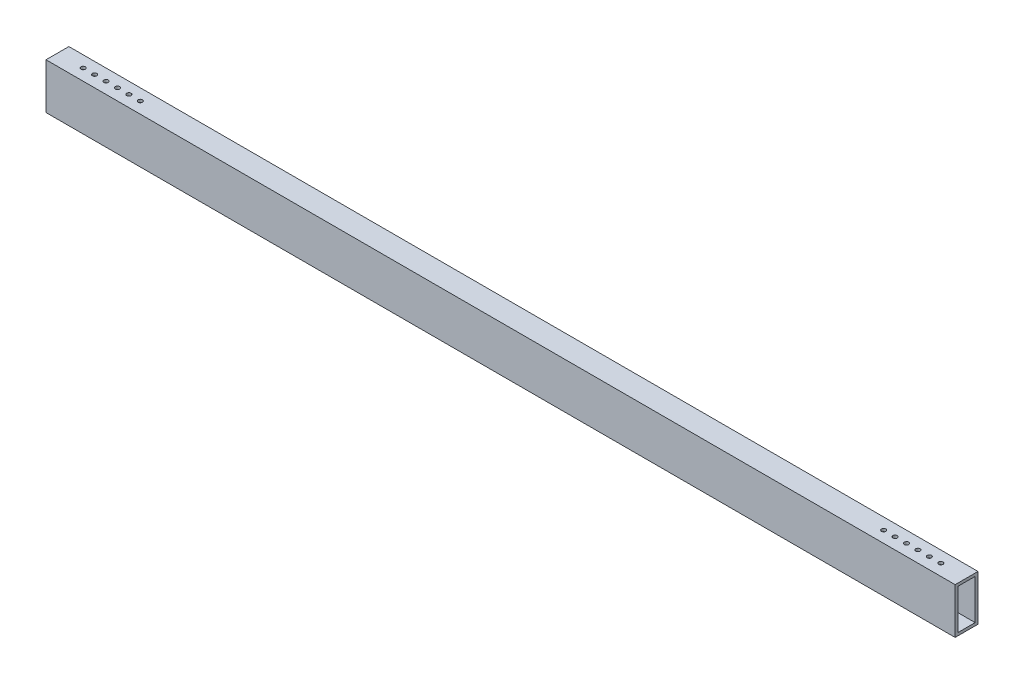
ISO-10303-21;
HEADER;
FILE_DESCRIPTION(('STEP AP214'),'2;1');
FILE_NAME('part.step','',(''),(''),'','','');
FILE_SCHEMA(('AUTOMOTIVE_DESIGN { 1 0 10303 214 1 1 1 1 }'));
ENDSEC;
DATA;
#1=APPLICATION_CONTEXT('core data for automotive mechanical design processes');
#2=APPLICATION_PROTOCOL_DEFINITION('international standard','automotive_design',2000,#1);
#3=PRODUCT_CONTEXT('',#1,'mechanical');
#4=PRODUCT('Part','Part','',(#3));
#5=PRODUCT_RELATED_PRODUCT_CATEGORY('part','',(#4));
#6=PRODUCT_DEFINITION_FORMATION('','',#4);
#7=PRODUCT_DEFINITION_CONTEXT('part definition',#1,'design');
#8=PRODUCT_DEFINITION('design','',#6,#7);
#9=PRODUCT_DEFINITION_SHAPE('','',#8);
#10=(LENGTH_UNIT() NAMED_UNIT(*) SI_UNIT(.MILLI.,.METRE.));
#11=(NAMED_UNIT(*) PLANE_ANGLE_UNIT() SI_UNIT($,.RADIAN.));
#12=(NAMED_UNIT(*) SI_UNIT($,.STERADIAN.) SOLID_ANGLE_UNIT());
#13=UNCERTAINTY_MEASURE_WITH_UNIT(LENGTH_MEASURE(1.E-05),#10,'distance_accuracy_value','');
#14=(GEOMETRIC_REPRESENTATION_CONTEXT(3) GLOBAL_UNCERTAINTY_ASSIGNED_CONTEXT((#13)) GLOBAL_UNIT_ASSIGNED_CONTEXT((#10,
#11,#12)) REPRESENTATION_CONTEXT('',''));
#15=CARTESIAN_POINT('',(0.,0.,0.));
#16=DIRECTION('',(0.,0.,1.));
#17=DIRECTION('',(1.,0.,0.));
#18=AXIS2_PLACEMENT_3D('',#15,#16,#17);
#19=CARTESIAN_POINT('',(412.75,19.05,0.));
#20=DIRECTION('',(0.,1.,0.));
#21=DIRECTION('',(0.,0.,1.));
#22=AXIS2_PLACEMENT_3D('',#19,#20,#21);
#23=CYLINDRICAL_SURFACE('',#22,2.413);
#24=CARTESIAN_POINT('',(412.75,22.225,0.));
#25=DIRECTION('',(0.,1.,0.));
#26=DIRECTION('',(0.,0.,1.));
#27=AXIS2_PLACEMENT_3D('',#24,#25,#26);
#28=CIRCLE('',#27,2.413);
#29=CARTESIAN_POINT('',(412.75,22.225,2.413));
#30=VERTEX_POINT('',#29);
#31=EDGE_CURVE('E20',#30,#30,#28,.F.);
#32=ORIENTED_EDGE('',*,*,#31,.T.);
#33=EDGE_LOOP('',(#32));
#34=FACE_BOUND('',#33,.T.);
#35=CARTESIAN_POINT('',(412.75,25.4,0.));
#36=DIRECTION('',(0.,1.,0.));
#37=DIRECTION('',(0.,0.,1.));
#38=AXIS2_PLACEMENT_3D('',#35,#36,#37);
#39=CIRCLE('',#38,2.413);
#40=CARTESIAN_POINT('',(412.75,25.4,2.413));
#41=VERTEX_POINT('',#40);
#42=EDGE_CURVE('E94',#41,#41,#39,.T.);
#43=ORIENTED_EDGE('',*,*,#42,.T.);
#44=EDGE_LOOP('',(#43));
#45=FACE_BOUND('',#44,.T.);
#46=ADVANCED_FACE('F17',(#34,#45),#23,.F.);
#47=CARTESIAN_POINT('',(425.45,19.05,0.));
#48=DIRECTION('',(0.,1.,0.));
#49=DIRECTION('',(0.,0.,1.));
#50=AXIS2_PLACEMENT_3D('',#47,#48,#49);
#51=CYLINDRICAL_SURFACE('',#50,2.413);
#52=CARTESIAN_POINT('',(425.45,22.225,0.));
#53=DIRECTION('',(0.,1.,0.));
#54=DIRECTION('',(0.,0.,1.));
#55=AXIS2_PLACEMENT_3D('',#52,#53,#54);
#56=CIRCLE('',#55,2.413);
#57=CARTESIAN_POINT('',(425.45,22.225,2.413));
#58=VERTEX_POINT('',#57);
#59=EDGE_CURVE('E193',#58,#58,#56,.F.);
#60=ORIENTED_EDGE('',*,*,#59,.T.);
#61=EDGE_LOOP('',(#60));
#62=FACE_BOUND('',#61,.T.);
#63=CARTESIAN_POINT('',(425.45,25.4,0.));
#64=DIRECTION('',(0.,1.,0.));
#65=DIRECTION('',(0.,0.,1.));
#66=AXIS2_PLACEMENT_3D('',#63,#64,#65);
#67=CIRCLE('',#66,2.413);
#68=CARTESIAN_POINT('',(425.45,25.4,2.413));
#69=VERTEX_POINT('',#68);
#70=EDGE_CURVE('E156',#69,#69,#67,.T.);
#71=ORIENTED_EDGE('',*,*,#70,.T.);
#72=EDGE_LOOP('',(#71));
#73=FACE_BOUND('',#72,.T.);
#74=ADVANCED_FACE('F301',(#62,#73),#51,.F.);
#75=CARTESIAN_POINT('',(438.15,19.05,0.));
#76=DIRECTION('',(0.,1.,0.));
#77=DIRECTION('',(0.,0.,1.));
#78=AXIS2_PLACEMENT_3D('',#75,#76,#77);
#79=CYLINDRICAL_SURFACE('',#78,2.413);
#80=CARTESIAN_POINT('',(438.15,22.225,0.));
#81=DIRECTION('',(0.,1.,0.));
#82=DIRECTION('',(0.,0.,1.));
#83=AXIS2_PLACEMENT_3D('',#80,#81,#82);
#84=CIRCLE('',#83,2.413);
#85=CARTESIAN_POINT('',(438.15,22.225,2.413));
#86=VERTEX_POINT('',#85);
#87=EDGE_CURVE('E191',#86,#86,#84,.F.);
#88=ORIENTED_EDGE('',*,*,#87,.T.);
#89=EDGE_LOOP('',(#88));
#90=FACE_BOUND('',#89,.T.);
#91=CARTESIAN_POINT('',(438.15,25.4,0.));
#92=DIRECTION('',(0.,1.,0.));
#93=DIRECTION('',(0.,0.,1.));
#94=AXIS2_PLACEMENT_3D('',#91,#92,#93);
#95=CIRCLE('',#94,2.413);
#96=CARTESIAN_POINT('',(438.15,25.4,2.413));
#97=VERTEX_POINT('',#96);
#98=EDGE_CURVE('E153',#97,#97,#95,.T.);
#99=ORIENTED_EDGE('',*,*,#98,.T.);
#100=EDGE_LOOP('',(#99));
#101=FACE_BOUND('',#100,.T.);
#102=ADVANCED_FACE('F298',(#90,#101),#79,.F.);
#103=CARTESIAN_POINT('',(450.85,19.05,0.));
#104=DIRECTION('',(0.,1.,0.));
#105=DIRECTION('',(0.,0.,1.));
#106=AXIS2_PLACEMENT_3D('',#103,#104,#105);
#107=CYLINDRICAL_SURFACE('',#106,2.413);
#108=CARTESIAN_POINT('',(450.85,22.225,0.));
#109=DIRECTION('',(0.,1.,0.));
#110=DIRECTION('',(0.,0.,1.));
#111=AXIS2_PLACEMENT_3D('',#108,#109,#110);
#112=CIRCLE('',#111,2.413);
#113=CARTESIAN_POINT('',(450.85,22.225,2.413));
#114=VERTEX_POINT('',#113);
#115=EDGE_CURVE('E188',#114,#114,#112,.F.);
#116=ORIENTED_EDGE('',*,*,#115,.T.);
#117=EDGE_LOOP('',(#116));
#118=FACE_BOUND('',#117,.T.);
#119=CARTESIAN_POINT('',(450.85,25.4,0.));
#120=DIRECTION('',(0.,1.,0.));
#121=DIRECTION('',(0.,0.,1.));
#122=AXIS2_PLACEMENT_3D('',#119,#120,#121);
#123=CIRCLE('',#122,2.413);
#124=CARTESIAN_POINT('',(450.85,25.4,2.413));
#125=VERTEX_POINT('',#124);
#126=EDGE_CURVE('E150',#125,#125,#123,.T.);
#127=ORIENTED_EDGE('',*,*,#126,.T.);
#128=EDGE_LOOP('',(#127));
#129=FACE_BOUND('',#128,.T.);
#130=ADVANCED_FACE('F294',(#118,#129),#107,.F.);
#131=CARTESIAN_POINT('',(463.55,19.05,0.));
#132=DIRECTION('',(0.,1.,0.));
#133=DIRECTION('',(0.,0.,1.));
#134=AXIS2_PLACEMENT_3D('',#131,#132,#133);
#135=CYLINDRICAL_SURFACE('',#134,2.413);
#136=CARTESIAN_POINT('',(463.55,22.225,0.));
#137=DIRECTION('',(0.,1.,0.));
#138=DIRECTION('',(0.,0.,1.));
#139=AXIS2_PLACEMENT_3D('',#136,#137,#138);
#140=CIRCLE('',#139,2.413);
#141=CARTESIAN_POINT('',(463.55,22.225,2.413));
#142=VERTEX_POINT('',#141);
#143=EDGE_CURVE('E185',#142,#142,#140,.F.);
#144=ORIENTED_EDGE('',*,*,#143,.T.);
#145=EDGE_LOOP('',(#144));
#146=FACE_BOUND('',#145,.T.);
#147=CARTESIAN_POINT('',(463.55,25.4,0.));
#148=DIRECTION('',(0.,1.,0.));
#149=DIRECTION('',(0.,0.,1.));
#150=AXIS2_PLACEMENT_3D('',#147,#148,#149);
#151=CIRCLE('',#150,2.413);
#152=CARTESIAN_POINT('',(463.55,25.4,2.413));
#153=VERTEX_POINT('',#152);
#154=EDGE_CURVE('E147',#153,#153,#151,.T.);
#155=ORIENTED_EDGE('',*,*,#154,.T.);
#156=EDGE_LOOP('',(#155));
#157=FACE_BOUND('',#156,.T.);
#158=ADVANCED_FACE('F290',(#146,#157),#135,.F.);
#159=CARTESIAN_POINT('',(476.25,19.05,0.));
#160=DIRECTION('',(0.,1.,0.));
#161=DIRECTION('',(0.,0.,1.));
#162=AXIS2_PLACEMENT_3D('',#159,#160,#161);
#163=CYLINDRICAL_SURFACE('',#162,2.413);
#164=CARTESIAN_POINT('',(476.25,22.225,0.));
#165=DIRECTION('',(0.,1.,0.));
#166=DIRECTION('',(0.,0.,1.));
#167=AXIS2_PLACEMENT_3D('',#164,#165,#166);
#168=CIRCLE('',#167,2.413);
#169=CARTESIAN_POINT('',(476.25,22.225,2.413));
#170=VERTEX_POINT('',#169);
#171=EDGE_CURVE('E182',#170,#170,#168,.F.);
#172=ORIENTED_EDGE('',*,*,#171,.T.);
#173=EDGE_LOOP('',(#172));
#174=FACE_BOUND('',#173,.T.);
#175=CARTESIAN_POINT('',(476.25,25.4,0.));
#176=DIRECTION('',(0.,1.,0.));
#177=DIRECTION('',(0.,0.,1.));
#178=AXIS2_PLACEMENT_3D('',#175,#176,#177);
#179=CIRCLE('',#178,2.413);
#180=CARTESIAN_POINT('',(476.25,25.4,2.413));
#181=VERTEX_POINT('',#180);
#182=EDGE_CURVE('E144',#181,#181,#179,.T.);
#183=ORIENTED_EDGE('',*,*,#182,.T.);
#184=EDGE_LOOP('',(#183));
#185=FACE_BOUND('',#184,.T.);
#186=ADVANCED_FACE('F286',(#174,#185),#163,.F.);
#187=CARTESIAN_POINT('',(-412.75,19.05,0.));
#188=DIRECTION('',(0.,1.,0.));
#189=DIRECTION('',(0.,0.,1.));
#190=AXIS2_PLACEMENT_3D('',#187,#188,#189);
#191=CYLINDRICAL_SURFACE('',#190,2.413);
#192=CARTESIAN_POINT('',(-412.75,22.225,0.));
#193=DIRECTION('',(0.,1.,0.));
#194=DIRECTION('',(0.,0.,1.));
#195=AXIS2_PLACEMENT_3D('',#192,#193,#194);
#196=CIRCLE('',#195,2.413);
#197=CARTESIAN_POINT('',(-412.75,22.225,2.413));
#198=VERTEX_POINT('',#197);
#199=EDGE_CURVE('E179',#198,#198,#196,.F.);
#200=ORIENTED_EDGE('',*,*,#199,.T.);
#201=EDGE_LOOP('',(#200));
#202=FACE_BOUND('',#201,.T.);
#203=CARTESIAN_POINT('',(-412.75,25.4,0.));
#204=DIRECTION('',(0.,1.,0.));
#205=DIRECTION('',(0.,0.,1.));
#206=AXIS2_PLACEMENT_3D('',#203,#204,#205);
#207=CIRCLE('',#206,2.413);
#208=CARTESIAN_POINT('',(-412.75,25.4,2.413));
#209=VERTEX_POINT('',#208);
#210=EDGE_CURVE('E141',#209,#209,#207,.T.);
#211=ORIENTED_EDGE('',*,*,#210,.T.);
#212=EDGE_LOOP('',(#211));
#213=FACE_BOUND('',#212,.T.);
#214=ADVANCED_FACE('F282',(#202,#213),#191,.F.);
#215=CARTESIAN_POINT('',(-425.45,19.05,0.));
#216=DIRECTION('',(0.,1.,0.));
#217=DIRECTION('',(0.,0.,1.));
#218=AXIS2_PLACEMENT_3D('',#215,#216,#217);
#219=CYLINDRICAL_SURFACE('',#218,2.413);
#220=CARTESIAN_POINT('',(-425.45,22.225,0.));
#221=DIRECTION('',(0.,1.,0.));
#222=DIRECTION('',(0.,0.,1.));
#223=AXIS2_PLACEMENT_3D('',#220,#221,#222);
#224=CIRCLE('',#223,2.413);
#225=CARTESIAN_POINT('',(-425.45,22.225,2.413));
#226=VERTEX_POINT('',#225);
#227=EDGE_CURVE('E176',#226,#226,#224,.F.);
#228=ORIENTED_EDGE('',*,*,#227,.T.);
#229=EDGE_LOOP('',(#228));
#230=FACE_BOUND('',#229,.T.);
#231=CARTESIAN_POINT('',(-425.45,25.4,0.));
#232=DIRECTION('',(0.,1.,0.));
#233=DIRECTION('',(0.,0.,1.));
#234=AXIS2_PLACEMENT_3D('',#231,#232,#233);
#235=CIRCLE('',#234,2.413);
#236=CARTESIAN_POINT('',(-425.45,25.4,2.413));
#237=VERTEX_POINT('',#236);
#238=EDGE_CURVE('E138',#237,#237,#235,.T.);
#239=ORIENTED_EDGE('',*,*,#238,.T.);
#240=EDGE_LOOP('',(#239));
#241=FACE_BOUND('',#240,.T.);
#242=ADVANCED_FACE('F278',(#230,#241),#219,.F.);
#243=CARTESIAN_POINT('',(-438.15,19.05,0.));
#244=DIRECTION('',(0.,1.,0.));
#245=DIRECTION('',(0.,0.,1.));
#246=AXIS2_PLACEMENT_3D('',#243,#244,#245);
#247=CYLINDRICAL_SURFACE('',#246,2.413);
#248=CARTESIAN_POINT('',(-438.15,22.225,0.));
#249=DIRECTION('',(0.,1.,0.));
#250=DIRECTION('',(0.,0.,1.));
#251=AXIS2_PLACEMENT_3D('',#248,#249,#250);
#252=CIRCLE('',#251,2.413);
#253=CARTESIAN_POINT('',(-438.15,22.225,2.413));
#254=VERTEX_POINT('',#253);
#255=EDGE_CURVE('E173',#254,#254,#252,.F.);
#256=ORIENTED_EDGE('',*,*,#255,.T.);
#257=EDGE_LOOP('',(#256));
#258=FACE_BOUND('',#257,.T.);
#259=CARTESIAN_POINT('',(-438.15,25.4,0.));
#260=DIRECTION('',(0.,1.,0.));
#261=DIRECTION('',(0.,0.,1.));
#262=AXIS2_PLACEMENT_3D('',#259,#260,#261);
#263=CIRCLE('',#262,2.413);
#264=CARTESIAN_POINT('',(-438.15,25.4,2.413));
#265=VERTEX_POINT('',#264);
#266=EDGE_CURVE('E135',#265,#265,#263,.T.);
#267=ORIENTED_EDGE('',*,*,#266,.T.);
#268=EDGE_LOOP('',(#267));
#269=FACE_BOUND('',#268,.T.);
#270=ADVANCED_FACE('F274',(#258,#269),#247,.F.);
#271=CARTESIAN_POINT('',(-450.85,19.05,0.));
#272=DIRECTION('',(0.,1.,0.));
#273=DIRECTION('',(0.,0.,1.));
#274=AXIS2_PLACEMENT_3D('',#271,#272,#273);
#275=CYLINDRICAL_SURFACE('',#274,2.413);
#276=CARTESIAN_POINT('',(-450.85,22.225,0.));
#277=DIRECTION('',(0.,1.,0.));
#278=DIRECTION('',(0.,0.,1.));
#279=AXIS2_PLACEMENT_3D('',#276,#277,#278);
#280=CIRCLE('',#279,2.413);
#281=CARTESIAN_POINT('',(-450.85,22.225,2.413));
#282=VERTEX_POINT('',#281);
#283=EDGE_CURVE('E170',#282,#282,#280,.F.);
#284=ORIENTED_EDGE('',*,*,#283,.T.);
#285=EDGE_LOOP('',(#284));
#286=FACE_BOUND('',#285,.T.);
#287=CARTESIAN_POINT('',(-450.85,25.4,0.));
#288=DIRECTION('',(0.,1.,0.));
#289=DIRECTION('',(0.,0.,1.));
#290=AXIS2_PLACEMENT_3D('',#287,#288,#289);
#291=CIRCLE('',#290,2.413);
#292=CARTESIAN_POINT('',(-450.85,25.4,2.413));
#293=VERTEX_POINT('',#292);
#294=EDGE_CURVE('E132',#293,#293,#291,.T.);
#295=ORIENTED_EDGE('',*,*,#294,.T.);
#296=EDGE_LOOP('',(#295));
#297=FACE_BOUND('',#296,.T.);
#298=ADVANCED_FACE('F270',(#286,#297),#275,.F.);
#299=CARTESIAN_POINT('',(-463.55,19.05,0.));
#300=DIRECTION('',(0.,1.,0.));
#301=DIRECTION('',(0.,0.,1.));
#302=AXIS2_PLACEMENT_3D('',#299,#300,#301);
#303=CYLINDRICAL_SURFACE('',#302,2.413);
#304=CARTESIAN_POINT('',(-463.55,22.225,0.));
#305=DIRECTION('',(0.,1.,0.));
#306=DIRECTION('',(0.,0.,1.));
#307=AXIS2_PLACEMENT_3D('',#304,#305,#306);
#308=CIRCLE('',#307,2.413);
#309=CARTESIAN_POINT('',(-463.55,22.225,2.413));
#310=VERTEX_POINT('',#309);
#311=EDGE_CURVE('E167',#310,#310,#308,.F.);
#312=ORIENTED_EDGE('',*,*,#311,.T.);
#313=EDGE_LOOP('',(#312));
#314=FACE_BOUND('',#313,.T.);
#315=CARTESIAN_POINT('',(-463.55,25.4,0.));
#316=DIRECTION('',(0.,1.,0.));
#317=DIRECTION('',(0.,0.,1.));
#318=AXIS2_PLACEMENT_3D('',#315,#316,#317);
#319=CIRCLE('',#318,2.413);
#320=CARTESIAN_POINT('',(-463.55,25.4,2.413));
#321=VERTEX_POINT('',#320);
#322=EDGE_CURVE('E129',#321,#321,#319,.T.);
#323=ORIENTED_EDGE('',*,*,#322,.T.);
#324=EDGE_LOOP('',(#323));
#325=FACE_BOUND('',#324,.T.);
#326=ADVANCED_FACE('F264',(#314,#325),#303,.F.);
#327=CARTESIAN_POINT('',(-476.25,19.05,0.));
#328=DIRECTION('',(0.,1.,0.));
#329=DIRECTION('',(0.,0.,1.));
#330=AXIS2_PLACEMENT_3D('',#327,#328,#329);
#331=CYLINDRICAL_SURFACE('',#330,2.413);
#332=CARTESIAN_POINT('',(-476.25,22.225,0.));
#333=DIRECTION('',(0.,1.,0.));
#334=DIRECTION('',(0.,0.,1.));
#335=AXIS2_PLACEMENT_3D('',#332,#333,#334);
#336=CIRCLE('',#335,2.413);
#337=CARTESIAN_POINT('',(-476.25,22.225,2.413));
#338=VERTEX_POINT('',#337);
#339=EDGE_CURVE('E118',#338,#338,#336,.F.);
#340=ORIENTED_EDGE('',*,*,#339,.T.);
#341=EDGE_LOOP('',(#340));
#342=FACE_BOUND('',#341,.T.);
#343=CARTESIAN_POINT('',(-476.25,25.4,0.));
#344=DIRECTION('',(0.,1.,0.));
#345=DIRECTION('',(0.,0.,1.));
#346=AXIS2_PLACEMENT_3D('',#343,#344,#345);
#347=CIRCLE('',#346,2.413);
#348=CARTESIAN_POINT('',(-476.25,25.4,2.413));
#349=VERTEX_POINT('',#348);
#350=EDGE_CURVE('E108',#349,#349,#347,.T.);
#351=ORIENTED_EDGE('',*,*,#350,.T.);
#352=EDGE_LOOP('',(#351));
#353=FACE_BOUND('',#352,.T.);
#354=ADVANCED_FACE('F257',(#342,#353),#331,.F.);
#355=CARTESIAN_POINT('',(444.5,-19.05,0.));
#356=DIRECTION('',(0.,-1.,0.));
#357=DIRECTION('',(0.,0.,-1.));
#358=AXIS2_PLACEMENT_3D('',#355,#356,#357);
#359=CYLINDRICAL_SURFACE('',#358,2.01929999999998);
#360=CARTESIAN_POINT('',(444.5,-22.225,0.));
#361=DIRECTION('',(0.,-1.,0.));
#362=DIRECTION('',(0.,0.,-1.));
#363=AXIS2_PLACEMENT_3D('',#360,#361,#362);
#364=CIRCLE('',#363,2.01929999999998);
#365=CARTESIAN_POINT('',(444.5,-22.225,-2.01929999999998));
#366=VERTEX_POINT('',#365);
#367=EDGE_CURVE('E117',#366,#366,#364,.F.);
#368=ORIENTED_EDGE('',*,*,#367,.T.);
#369=EDGE_LOOP('',(#368));
#370=FACE_BOUND('',#369,.T.);
#371=CARTESIAN_POINT('',(444.5,-25.4,0.));
#372=DIRECTION('',(0.,-1.,0.));
#373=DIRECTION('',(0.,0.,-1.));
#374=AXIS2_PLACEMENT_3D('',#371,#372,#373);
#375=CIRCLE('',#374,2.01929999999998);
#376=CARTESIAN_POINT('',(444.5,-25.4,-2.01929999999998));
#377=VERTEX_POINT('',#376);
#378=EDGE_CURVE('E123',#377,#377,#375,.T.);
#379=ORIENTED_EDGE('',*,*,#378,.T.);
#380=EDGE_LOOP('',(#379));
#381=FACE_BOUND('',#380,.T.);
#382=ADVANCED_FACE('F214',(#370,#381),#359,.F.);
#383=CARTESIAN_POINT('',(-444.5,-19.05,0.));
#384=DIRECTION('',(0.,-1.,0.));
#385=DIRECTION('',(0.,0.,-1.));
#386=AXIS2_PLACEMENT_3D('',#383,#384,#385);
#387=CYLINDRICAL_SURFACE('',#386,2.01929999999998);
#388=CARTESIAN_POINT('',(-444.5,-22.225,0.));
#389=DIRECTION('',(0.,-1.,0.));
#390=DIRECTION('',(0.,0.,-1.));
#391=AXIS2_PLACEMENT_3D('',#388,#389,#390);
#392=CIRCLE('',#391,2.01929999999998);
#393=CARTESIAN_POINT('',(-444.5,-22.225,-2.01929999999998));
#394=VERTEX_POINT('',#393);
#395=EDGE_CURVE('E115',#394,#394,#392,.F.);
#396=ORIENTED_EDGE('',*,*,#395,.T.);
#397=EDGE_LOOP('',(#396));
#398=FACE_BOUND('',#397,.T.);
#399=CARTESIAN_POINT('',(-444.5,-25.4,0.));
#400=DIRECTION('',(0.,-1.,0.));
#401=DIRECTION('',(0.,0.,-1.));
#402=AXIS2_PLACEMENT_3D('',#399,#400,#401);
#403=CIRCLE('',#402,2.01929999999998);
#404=CARTESIAN_POINT('',(-444.5,-25.4,-2.01929999999998));
#405=VERTEX_POINT('',#404);
#406=EDGE_CURVE('E119',#405,#405,#403,.T.);
#407=ORIENTED_EDGE('',*,*,#406,.T.);
#408=EDGE_LOOP('',(#407));
#409=FACE_BOUND('',#408,.T.);
#410=ADVANCED_FACE('F204',(#398,#409),#387,.F.);
#411=CARTESIAN_POINT('',(-504.825,22.225,-9.525));
#412=DIRECTION('',(0.,1.,0.));
#413=DIRECTION('',(0.,0.,1.));
#414=AXIS2_PLACEMENT_3D('',#411,#412,#413);
#415=PLANE('',#414);
#416=DIRECTION('',(1.,0.,0.));
#417=VECTOR('',#416,1.);
#418=CARTESIAN_POINT('',(-504.825,22.225,9.525));
#419=LINE('',#418,#417);
#420=CARTESIAN_POINT('',(504.825,22.225,9.525));
#421=VERTEX_POINT('',#420);
#422=CARTESIAN_POINT('',(-504.825,22.225,9.525));
#423=VERTEX_POINT('',#422);
#424=EDGE_CURVE('E104',#421,#423,#419,.F.);
#425=ORIENTED_EDGE('',*,*,#424,.T.);
#426=DIRECTION('',(0.,0.,-1.));
#427=VECTOR('',#426,1.);
#428=CARTESIAN_POINT('',(-504.825,22.225,12.7));
#429=LINE('',#428,#427);
#430=CARTESIAN_POINT('',(-504.825,22.225,-9.525));
#431=VERTEX_POINT('',#430);
#432=EDGE_CURVE('E80',#423,#431,#429,.T.);
#433=ORIENTED_EDGE('',*,*,#432,.T.);
#434=DIRECTION('',(-1.,0.,0.));
#435=VECTOR('',#434,1.);
#436=CARTESIAN_POINT('',(-504.825,22.225,-9.525));
#437=LINE('',#436,#435);
#438=CARTESIAN_POINT('',(504.825,22.225,-9.525));
#439=VERTEX_POINT('',#438);
#440=EDGE_CURVE('E87',#431,#439,#437,.F.);
#441=ORIENTED_EDGE('',*,*,#440,.T.);
#442=DIRECTION('',(0.,0.,1.));
#443=VECTOR('',#442,1.);
#444=CARTESIAN_POINT('',(504.825,22.225,12.7));
#445=LINE('',#444,#443);
#446=EDGE_CURVE('E511',#439,#421,#445,.T.);
#447=ORIENTED_EDGE('',*,*,#446,.T.);
#448=EDGE_LOOP('',(#425,#433,#441,#447));
#449=FACE_BOUND('',#448,.T.);
#450=ORIENTED_EDGE('',*,*,#339,.F.);
#451=EDGE_LOOP('',(#450));
#452=FACE_BOUND('',#451,.T.);
#453=ORIENTED_EDGE('',*,*,#311,.F.);
#454=EDGE_LOOP('',(#453));
#455=FACE_BOUND('',#454,.T.);
#456=ORIENTED_EDGE('',*,*,#283,.F.);
#457=EDGE_LOOP('',(#456));
#458=FACE_BOUND('',#457,.T.);
#459=ORIENTED_EDGE('',*,*,#255,.F.);
#460=EDGE_LOOP('',(#459));
#461=FACE_BOUND('',#460,.T.);
#462=ORIENTED_EDGE('',*,*,#227,.F.);
#463=EDGE_LOOP('',(#462));
#464=FACE_BOUND('',#463,.T.);
#465=ORIENTED_EDGE('',*,*,#199,.F.);
#466=EDGE_LOOP('',(#465));
#467=FACE_BOUND('',#466,.T.);
#468=ORIENTED_EDGE('',*,*,#171,.F.);
#469=EDGE_LOOP('',(#468));
#470=FACE_BOUND('',#469,.T.);
#471=ORIENTED_EDGE('',*,*,#143,.F.);
#472=EDGE_LOOP('',(#471));
#473=FACE_BOUND('',#472,.T.);
#474=ORIENTED_EDGE('',*,*,#115,.F.);
#475=EDGE_LOOP('',(#474));
#476=FACE_BOUND('',#475,.T.);
#477=ORIENTED_EDGE('',*,*,#87,.F.);
#478=EDGE_LOOP('',(#477));
#479=FACE_BOUND('',#478,.T.);
#480=ORIENTED_EDGE('',*,*,#59,.F.);
#481=EDGE_LOOP('',(#480));
#482=FACE_BOUND('',#481,.T.);
#483=ORIENTED_EDGE('',*,*,#31,.F.);
#484=EDGE_LOOP('',(#483));
#485=FACE_BOUND('',#484,.T.);
#486=ADVANCED_FACE('F102',(#449,#452,#455,#458,#461,#464,#467,#470,#473,#476,#479,#482,#485),
#415,.F.);
#487=CARTESIAN_POINT('',(-504.825,22.225,9.525));
#488=DIRECTION('',(0.,0.,1.));
#489=DIRECTION('',(1.,0.,0.));
#490=AXIS2_PLACEMENT_3D('',#487,#488,#489);
#491=PLANE('',#490);
#492=DIRECTION('',(1.,0.,0.));
#493=VECTOR('',#492,1.);
#494=CARTESIAN_POINT('',(-504.825,-22.225,9.525));
#495=LINE('',#494,#493);
#496=CARTESIAN_POINT('',(504.825,-22.225,9.525));
#497=VERTEX_POINT('',#496);
#498=CARTESIAN_POINT('',(-504.825,-22.225,9.525));
#499=VERTEX_POINT('',#498);
#500=EDGE_CURVE('E113',#497,#499,#495,.F.);
#501=ORIENTED_EDGE('',*,*,#500,.T.);
#502=DIRECTION('',(0.,1.,0.));
#503=VECTOR('',#502,1.);
#504=CARTESIAN_POINT('',(-504.825,25.4,9.525));
#505=LINE('',#504,#503);
#506=EDGE_CURVE('E529',#499,#423,#505,.T.);
#507=ORIENTED_EDGE('',*,*,#506,.T.);
#508=ORIENTED_EDGE('',*,*,#424,.F.);
#509=DIRECTION('',(0.,1.,0.));
#510=VECTOR('',#509,1.);
#511=CARTESIAN_POINT('',(504.825,25.4,9.525));
#512=LINE('',#511,#510);
#513=EDGE_CURVE('E515',#421,#497,#512,.F.);
#514=ORIENTED_EDGE('',*,*,#513,.T.);
#515=EDGE_LOOP('',(#501,#507,#508,#514));
#516=FACE_BOUND('',#515,.T.);
#517=ADVANCED_FACE('F203',(#516),#491,.F.);
#518=CARTESIAN_POINT('',(-504.825,-22.225,9.525));
#519=DIRECTION('',(0.,-1.,0.));
#520=DIRECTION('',(0.,0.,-1.));
#521=AXIS2_PLACEMENT_3D('',#518,#519,#520);
#522=PLANE('',#521);
#523=DIRECTION('',(-1.,0.,0.));
#524=VECTOR('',#523,1.);
#525=CARTESIAN_POINT('',(-504.825,-22.225,-9.525));
#526=LINE('',#525,#524);
#527=CARTESIAN_POINT('',(504.825,-22.225,-9.525));
#528=VERTEX_POINT('',#527);
#529=CARTESIAN_POINT('',(-504.825,-22.225,-9.525));
#530=VERTEX_POINT('',#529);
#531=EDGE_CURVE('E95',#528,#530,#526,.T.);
#532=ORIENTED_EDGE('',*,*,#531,.T.);
#533=DIRECTION('',(0.,0.,-1.));
#534=VECTOR('',#533,1.);
#535=CARTESIAN_POINT('',(-504.825,-22.225,12.7));
#536=LINE('',#535,#534);
#537=EDGE_CURVE('E100',#530,#499,#536,.F.);
#538=ORIENTED_EDGE('',*,*,#537,.T.);
#539=ORIENTED_EDGE('',*,*,#500,.F.);
#540=DIRECTION('',(0.,0.,1.));
#541=VECTOR('',#540,1.);
#542=CARTESIAN_POINT('',(504.825,-22.225,12.7));
#543=LINE('',#542,#541);
#544=EDGE_CURVE('E507',#497,#528,#543,.F.);
#545=ORIENTED_EDGE('',*,*,#544,.T.);
#546=EDGE_LOOP('',(#532,#538,#539,#545));
#547=FACE_BOUND('',#546,.T.);
#548=ORIENTED_EDGE('',*,*,#395,.F.);
#549=EDGE_LOOP('',(#548));
#550=FACE_BOUND('',#549,.T.);
#551=ORIENTED_EDGE('',*,*,#367,.F.);
#552=EDGE_LOOP('',(#551));
#553=FACE_BOUND('',#552,.T.);
#554=ADVANCED_FACE('F211',(#547,#550,#553),#522,.F.);
#555=CARTESIAN_POINT('',(-504.825,-22.225,-9.525));
#556=DIRECTION('',(0.,0.,-1.));
#557=DIRECTION('',(-1.,0.,0.));
#558=AXIS2_PLACEMENT_3D('',#555,#556,#557);
#559=PLANE('',#558);
#560=ORIENTED_EDGE('',*,*,#440,.F.);
#561=DIRECTION('',(0.,1.,0.));
#562=VECTOR('',#561,1.);
#563=CARTESIAN_POINT('',(-504.825,25.4,-9.525));
#564=LINE('',#563,#562);
#565=EDGE_CURVE('E89',#431,#530,#564,.F.);
#566=ORIENTED_EDGE('',*,*,#565,.T.);
#567=ORIENTED_EDGE('',*,*,#531,.F.);
#568=DIRECTION('',(0.,1.,0.));
#569=VECTOR('',#568,1.);
#570=CARTESIAN_POINT('',(504.825,25.4,-9.525));
#571=LINE('',#570,#569);
#572=EDGE_CURVE('E91',#528,#439,#571,.T.);
#573=ORIENTED_EDGE('',*,*,#572,.T.);
#574=EDGE_LOOP('',(#560,#566,#567,#573));
#575=FACE_BOUND('',#574,.T.);
#576=ADVANCED_FACE('F88',(#575),#559,.F.);
#577=CARTESIAN_POINT('',(0.,0.,12.7));
#578=DIRECTION('',(0.,0.,1.));
#579=DIRECTION('',(1.,0.,0.));
#580=AXIS2_PLACEMENT_3D('',#577,#578,#579);
#581=PLANE('',#580);
#582=DIRECTION('',(0.,1.,0.));
#583=VECTOR('',#582,1.);
#584=CARTESIAN_POINT('',(-504.825,25.4,12.7));
#585=LINE('',#584,#583);
#586=CARTESIAN_POINT('',(-504.825,25.4,12.7));
#587=VERTEX_POINT('',#586);
#588=CARTESIAN_POINT('',(-504.825,-25.4,12.7));
#589=VERTEX_POINT('',#588);
#590=EDGE_CURVE('E126',#587,#589,#585,.F.);
#591=ORIENTED_EDGE('',*,*,#590,.T.);
#592=DIRECTION('',(1.,0.,0.));
#593=VECTOR('',#592,1.);
#594=CARTESIAN_POINT('',(-504.825,-25.4,12.7));
#595=LINE('',#594,#593);
#596=CARTESIAN_POINT('',(504.825,-25.4,12.7));
#597=VERTEX_POINT('',#596);
#598=EDGE_CURVE('E521',#589,#597,#595,.T.);
#599=ORIENTED_EDGE('',*,*,#598,.T.);
#600=DIRECTION('',(0.,1.,0.));
#601=VECTOR('',#600,1.);
#602=CARTESIAN_POINT('',(504.825,25.4,12.7));
#603=LINE('',#602,#601);
#604=CARTESIAN_POINT('',(504.825,25.4,12.7));
#605=VERTEX_POINT('',#604);
#606=EDGE_CURVE('E513',#597,#605,#603,.T.);
#607=ORIENTED_EDGE('',*,*,#606,.T.);
#608=DIRECTION('',(1.,0.,0.));
#609=VECTOR('',#608,1.);
#610=CARTESIAN_POINT('',(-504.825,25.4,12.7));
#611=LINE('',#610,#609);
#612=EDGE_CURVE('E106',#605,#587,#611,.F.);
#613=ORIENTED_EDGE('',*,*,#612,.T.);
#614=EDGE_LOOP('',(#591,#599,#607,#613));
#615=FACE_BOUND('',#614,.T.);
#616=ADVANCED_FACE('F238',(#615),#581,.T.);
#617=CARTESIAN_POINT('',(-504.825,25.4,12.7));
#618=DIRECTION('',(0.,-1.,0.));
#619=DIRECTION('',(0.,0.,-1.));
#620=AXIS2_PLACEMENT_3D('',#617,#618,#619);
#621=PLANE('',#620);
#622=DIRECTION('',(0.,0.,-1.));
#623=VECTOR('',#622,1.);
#624=CARTESIAN_POINT('',(-504.825,25.4,12.7));
#625=LINE('',#624,#623);
#626=CARTESIAN_POINT('',(-504.825,25.4,-12.7));
#627=VERTEX_POINT('',#626);
#628=EDGE_CURVE('E526',#627,#587,#625,.F.);
#629=ORIENTED_EDGE('',*,*,#628,.T.);
#630=ORIENTED_EDGE('',*,*,#612,.F.);
#631=DIRECTION('',(0.,0.,1.));
#632=VECTOR('',#631,1.);
#633=CARTESIAN_POINT('',(504.825,25.4,12.7));
#634=LINE('',#633,#632);
#635=CARTESIAN_POINT('',(504.825,25.4,-12.7));
#636=VERTEX_POINT('',#635);
#637=EDGE_CURVE('E541',#605,#636,#634,.F.);
#638=ORIENTED_EDGE('',*,*,#637,.T.);
#639=DIRECTION('',(1.,0.,0.));
#640=VECTOR('',#639,1.);
#641=CARTESIAN_POINT('',(0.,25.4,-12.7));
#642=LINE('',#641,#640);
#643=EDGE_CURVE('E533',#636,#627,#642,.F.);
#644=ORIENTED_EDGE('',*,*,#643,.T.);
#645=EDGE_LOOP('',(#629,#630,#638,#644));
#646=FACE_BOUND('',#645,.T.);
#647=ORIENTED_EDGE('',*,*,#350,.F.);
#648=EDGE_LOOP('',(#647));
#649=FACE_BOUND('',#648,.T.);
#650=ORIENTED_EDGE('',*,*,#322,.F.);
#651=EDGE_LOOP('',(#650));
#652=FACE_BOUND('',#651,.T.);
#653=ORIENTED_EDGE('',*,*,#294,.F.);
#654=EDGE_LOOP('',(#653));
#655=FACE_BOUND('',#654,.T.);
#656=ORIENTED_EDGE('',*,*,#266,.F.);
#657=EDGE_LOOP('',(#656));
#658=FACE_BOUND('',#657,.T.);
#659=ORIENTED_EDGE('',*,*,#238,.F.);
#660=EDGE_LOOP('',(#659));
#661=FACE_BOUND('',#660,.T.);
#662=ORIENTED_EDGE('',*,*,#210,.F.);
#663=EDGE_LOOP('',(#662));
#664=FACE_BOUND('',#663,.T.);
#665=ORIENTED_EDGE('',*,*,#182,.F.);
#666=EDGE_LOOP('',(#665));
#667=FACE_BOUND('',#666,.T.);
#668=ORIENTED_EDGE('',*,*,#154,.F.);
#669=EDGE_LOOP('',(#668));
#670=FACE_BOUND('',#669,.T.);
#671=ORIENTED_EDGE('',*,*,#126,.F.);
#672=EDGE_LOOP('',(#671));
#673=FACE_BOUND('',#672,.T.);
#674=ORIENTED_EDGE('',*,*,#98,.F.);
#675=EDGE_LOOP('',(#674));
#676=FACE_BOUND('',#675,.T.);
#677=ORIENTED_EDGE('',*,*,#70,.F.);
#678=EDGE_LOOP('',(#677));
#679=FACE_BOUND('',#678,.T.);
#680=ORIENTED_EDGE('',*,*,#42,.F.);
#681=EDGE_LOOP('',(#680));
#682=FACE_BOUND('',#681,.T.);
#683=ADVANCED_FACE('F234',(#646,#649,#652,#655,#658,#661,#664,#667,#670,#673,#676,#679,#682),
#621,.F.);
#684=CARTESIAN_POINT('',(-504.825,25.4,12.7));
#685=DIRECTION('',(1.,0.,0.));
#686=DIRECTION('',(0.,0.,-1.));
#687=AXIS2_PLACEMENT_3D('',#684,#685,#686);
#688=PLANE('',#687);
#689=DIRECTION('',(0.,0.,1.));
#690=VECTOR('',#689,1.);
#691=CARTESIAN_POINT('',(-504.825,-25.4,12.7));
#692=LINE('',#691,#690);
#693=CARTESIAN_POINT('',(-504.825,-25.4,-12.7));
#694=VERTEX_POINT('',#693);
#695=EDGE_CURVE('E122',#694,#589,#692,.T.);
#696=ORIENTED_EDGE('',*,*,#695,.T.);
#697=ORIENTED_EDGE('',*,*,#590,.F.);
#698=ORIENTED_EDGE('',*,*,#628,.F.);
#699=DIRECTION('',(0.,1.,0.));
#700=VECTOR('',#699,1.);
#701=CARTESIAN_POINT('',(-504.825,0.,-12.7));
#702=LINE('',#701,#700);
#703=EDGE_CURVE('E537',#627,#694,#702,.F.);
#704=ORIENTED_EDGE('',*,*,#703,.T.);
#705=EDGE_LOOP('',(#696,#697,#698,#704));
#706=FACE_BOUND('',#705,.T.);
#707=ORIENTED_EDGE('',*,*,#537,.F.);
#708=ORIENTED_EDGE('',*,*,#565,.F.);
#709=ORIENTED_EDGE('',*,*,#432,.F.);
#710=ORIENTED_EDGE('',*,*,#506,.F.);
#711=EDGE_LOOP('',(#707,#708,#709,#710));
#712=FACE_BOUND('',#711,.T.);
#713=ADVANCED_FACE('F98',(#706,#712),#688,.F.);
#714=CARTESIAN_POINT('',(-504.825,-25.4,12.7));
#715=DIRECTION('',(0.,1.,0.));
#716=DIRECTION('',(0.,0.,1.));
#717=AXIS2_PLACEMENT_3D('',#714,#715,#716);
#718=PLANE('',#717);
#719=DIRECTION('',(0.,0.,1.));
#720=VECTOR('',#719,1.);
#721=CARTESIAN_POINT('',(504.825,-25.4,12.7));
#722=LINE('',#721,#720);
#723=CARTESIAN_POINT('',(504.825,-25.4,-12.7));
#724=VERTEX_POINT('',#723);
#725=EDGE_CURVE('E34',#724,#597,#722,.T.);
#726=ORIENTED_EDGE('',*,*,#725,.T.);
#727=ORIENTED_EDGE('',*,*,#598,.F.);
#728=ORIENTED_EDGE('',*,*,#695,.F.);
#729=DIRECTION('',(1.,0.,0.));
#730=VECTOR('',#729,1.);
#731=CARTESIAN_POINT('',(0.,-25.4,-12.7));
#732=LINE('',#731,#730);
#733=EDGE_CURVE('E26',#694,#724,#732,.T.);
#734=ORIENTED_EDGE('',*,*,#733,.T.);
#735=EDGE_LOOP('',(#726,#727,#728,#734));
#736=FACE_BOUND('',#735,.T.);
#737=ORIENTED_EDGE('',*,*,#406,.F.);
#738=EDGE_LOOP('',(#737));
#739=FACE_BOUND('',#738,.T.);
#740=ORIENTED_EDGE('',*,*,#378,.F.);
#741=EDGE_LOOP('',(#740));
#742=FACE_BOUND('',#741,.T.);
#743=ADVANCED_FACE('F225',(#736,#739,#742),#718,.F.);
#744=CARTESIAN_POINT('',(504.825,25.4,12.7));
#745=DIRECTION('',(-1.,0.,0.));
#746=DIRECTION('',(0.,0.,1.));
#747=AXIS2_PLACEMENT_3D('',#744,#745,#746);
#748=PLANE('',#747);
#749=ORIENTED_EDGE('',*,*,#637,.F.);
#750=ORIENTED_EDGE('',*,*,#606,.F.);
#751=ORIENTED_EDGE('',*,*,#725,.F.);
#752=DIRECTION('',(0.,1.,0.));
#753=VECTOR('',#752,1.);
#754=CARTESIAN_POINT('',(504.825,0.,-12.7));
#755=LINE('',#754,#753);
#756=EDGE_CURVE('E11',#724,#636,#755,.T.);
#757=ORIENTED_EDGE('',*,*,#756,.T.);
#758=EDGE_LOOP('',(#749,#750,#751,#757));
#759=FACE_BOUND('',#758,.T.);
#760=ORIENTED_EDGE('',*,*,#544,.F.);
#761=ORIENTED_EDGE('',*,*,#513,.F.);
#762=ORIENTED_EDGE('',*,*,#446,.F.);
#763=ORIENTED_EDGE('',*,*,#572,.F.);
#764=EDGE_LOOP('',(#760,#761,#762,#763));
#765=FACE_BOUND('',#764,.T.);
#766=ADVANCED_FACE('F219',(#759,#765),#748,.F.);
#767=CARTESIAN_POINT('',(0.,0.,-12.7));
#768=DIRECTION('',(0.,0.,1.));
#769=DIRECTION('',(1.,0.,0.));
#770=AXIS2_PLACEMENT_3D('',#767,#768,#769);
#771=PLANE('',#770);
#772=ORIENTED_EDGE('',*,*,#733,.F.);
#773=ORIENTED_EDGE('',*,*,#703,.F.);
#774=ORIENTED_EDGE('',*,*,#643,.F.);
#775=ORIENTED_EDGE('',*,*,#756,.F.);
#776=EDGE_LOOP('',(#772,#773,#774,#775));
#777=FACE_BOUND('',#776,.T.);
#778=ADVANCED_FACE('F217',(#777),#771,.F.);
#779=CLOSED_SHELL('',(#46,#74,#102,#130,#158,#186,#214,#242,#270,#298,#326,#354,#382,#410,#486,
#517,#554,#576,#616,#683,#713,#743,#766,#778));
#780=MANIFOLD_SOLID_BREP('B1',#779);
#781=ADVANCED_BREP_SHAPE_REPRESENTATION('',(#18,#780),#14);
#782=SHAPE_DEFINITION_REPRESENTATION(#9,#781);
ENDSEC;
END-ISO-10303-21;
